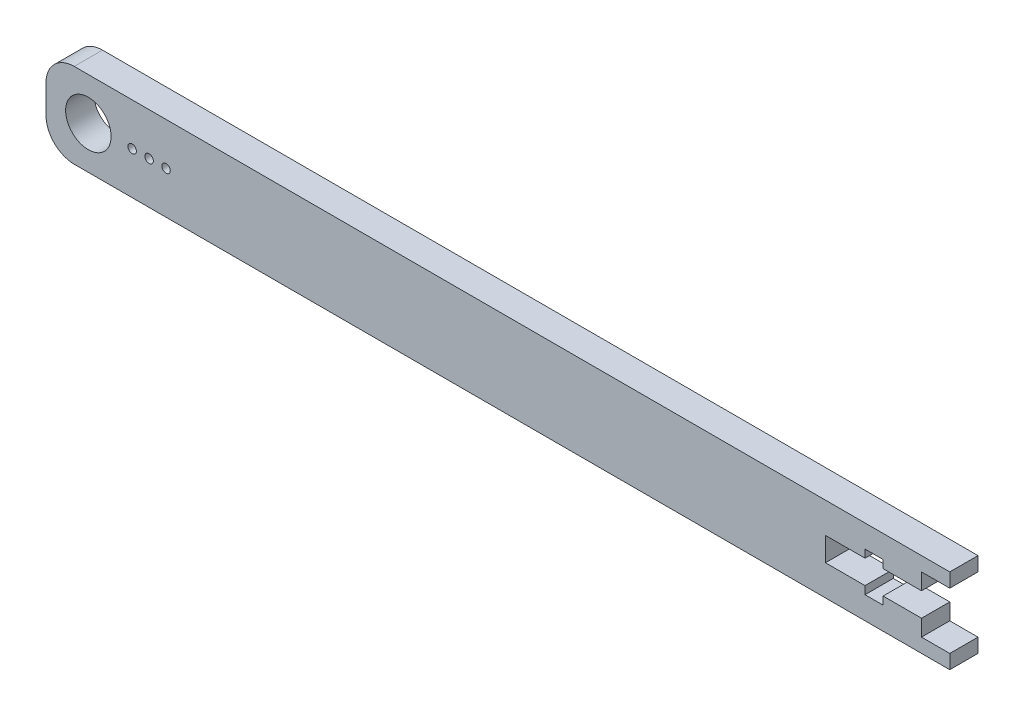
ISO-10303-21;
HEADER;
FILE_DESCRIPTION(('STEP AP214'),'2;1');
FILE_NAME('part.step','',(''),(''),'','','');
FILE_SCHEMA(('AUTOMOTIVE_DESIGN { 1 0 10303 214 1 1 1 1 }'));
ENDSEC;
DATA;
#1=APPLICATION_CONTEXT('core data for automotive mechanical design processes');
#2=APPLICATION_PROTOCOL_DEFINITION('international standard','automotive_design',2000,#1);
#3=PRODUCT_CONTEXT('',#1,'mechanical');
#4=PRODUCT('Part','Part','',(#3));
#5=PRODUCT_RELATED_PRODUCT_CATEGORY('part','',(#4));
#6=PRODUCT_DEFINITION_FORMATION('','',#4);
#7=PRODUCT_DEFINITION_CONTEXT('part definition',#1,'design');
#8=PRODUCT_DEFINITION('design','',#6,#7);
#9=PRODUCT_DEFINITION_SHAPE('','',#8);
#10=(LENGTH_UNIT() NAMED_UNIT(*) SI_UNIT(.MILLI.,.METRE.));
#11=(NAMED_UNIT(*) PLANE_ANGLE_UNIT() SI_UNIT($,.RADIAN.));
#12=(NAMED_UNIT(*) SI_UNIT($,.STERADIAN.) SOLID_ANGLE_UNIT());
#13=UNCERTAINTY_MEASURE_WITH_UNIT(LENGTH_MEASURE(1.E-05),#10,'distance_accuracy_value','');
#14=(GEOMETRIC_REPRESENTATION_CONTEXT(3) GLOBAL_UNCERTAINTY_ASSIGNED_CONTEXT((#13)) GLOBAL_UNIT_ASSIGNED_CONTEXT((#10,
#11,#12)) REPRESENTATION_CONTEXT('',''));
#15=CARTESIAN_POINT('',(0.,0.,0.));
#16=DIRECTION('',(0.,0.,1.));
#17=DIRECTION('',(1.,0.,0.));
#18=AXIS2_PLACEMENT_3D('',#15,#16,#17);
#19=CARTESIAN_POINT('',(-65.,12.5,5.));
#20=DIRECTION('',(1.,0.,0.));
#21=DIRECTION('',(0.,0.,-1.));
#22=AXIS2_PLACEMENT_3D('',#19,#20,#21);
#23=PLANE('',#22);
#24=DIRECTION('',(0.,0.,1.));
#25=VECTOR('',#24,1.);
#26=CARTESIAN_POINT('',(-65.,9.6,5.));
#27=LINE('',#26,#25);
#28=CARTESIAN_POINT('',(-65.,9.6,0.));
#29=VERTEX_POINT('',#28);
#30=CARTESIAN_POINT('',(-65.,9.6,5.));
#31=VERTEX_POINT('',#30);
#32=EDGE_CURVE('E11',#29,#31,#27,.T.);
#33=ORIENTED_EDGE('',*,*,#32,.F.);
#34=DIRECTION('',(0.,-1.,0.));
#35=VECTOR('',#34,1.);
#36=CARTESIAN_POINT('',(-65.,12.5,0.));
#37=LINE('',#36,#35);
#38=CARTESIAN_POINT('',(-65.,12.5,0.));
#39=VERTEX_POINT('',#38);
#40=EDGE_CURVE('E250',#39,#29,#37,.T.);
#41=ORIENTED_EDGE('',*,*,#40,.F.);
#42=DIRECTION('',(0.,0.,-1.));
#43=VECTOR('',#42,1.);
#44=CARTESIAN_POINT('',(-65.,12.5,5.));
#45=LINE('',#44,#43);
#46=CARTESIAN_POINT('',(-65.,12.5,5.));
#47=VERTEX_POINT('',#46);
#48=EDGE_CURVE('E266',#47,#39,#45,.T.);
#49=ORIENTED_EDGE('',*,*,#48,.F.);
#50=DIRECTION('',(0.,-1.,0.));
#51=VECTOR('',#50,1.);
#52=CARTESIAN_POINT('',(-65.,12.5,5.));
#53=LINE('',#52,#51);
#54=EDGE_CURVE('E394',#47,#31,#53,.T.);
#55=ORIENTED_EDGE('',*,*,#54,.T.);
#56=EDGE_LOOP('',(#33,#41,#49,#55));
#57=FACE_BOUND('',#56,.T.);
#58=ADVANCED_FACE('F33',(#57),#23,.T.);
#59=CARTESIAN_POINT('',(-215.,5.,5.));
#60=DIRECTION('',(0.,0.,1.));
#61=DIRECTION('',(1.,0.,0.));
#62=AXIS2_PLACEMENT_3D('',#59,#60,#61);
#63=PLANE('',#62);
#64=DIRECTION('',(0.,-1.,0.));
#65=VECTOR('',#64,1.);
#66=CARTESIAN_POINT('',(-60.,5.,5.));
#67=LINE('',#66,#65);
#68=CARTESIAN_POINT('',(-60.,15.,5.));
#69=VERTEX_POINT('',#68);
#70=CARTESIAN_POINT('',(-60.,12.5,5.));
#71=VERTEX_POINT('',#70);
#72=EDGE_CURVE('E56',#69,#71,#67,.T.);
#73=ORIENTED_EDGE('',*,*,#72,.F.);
#74=DIRECTION('',(-1.,0.,0.));
#75=VECTOR('',#74,1.);
#76=CARTESIAN_POINT('',(-215.,15.,5.));
#77=LINE('',#76,#75);
#78=CARTESIAN_POINT('',(-215.,15.,5.));
#79=VERTEX_POINT('',#78);
#80=EDGE_CURVE('E278',#69,#79,#77,.T.);
#81=ORIENTED_EDGE('',*,*,#80,.T.);
#82=CARTESIAN_POINT('',(-215.,10.,5.));
#83=DIRECTION('',(0.,0.,1.));
#84=DIRECTION('',(1.,0.,0.));
#85=AXIS2_PLACEMENT_3D('',#82,#83,#84);
#86=CIRCLE('',#85,5.);
#87=CARTESIAN_POINT('',(-220.,9.99999999999996,5.));
#88=VERTEX_POINT('',#87);
#89=EDGE_CURVE('E280',#79,#88,#86,.T.);
#90=ORIENTED_EDGE('',*,*,#89,.T.);
#91=DIRECTION('',(0.,-1.,0.));
#92=VECTOR('',#91,1.);
#93=CARTESIAN_POINT('',(-220.,9.99999999999996,5.));
#94=LINE('',#93,#92);
#95=CARTESIAN_POINT('',(-220.,5.00000000000004,5.));
#96=VERTEX_POINT('',#95);
#97=EDGE_CURVE('E226',#88,#96,#94,.T.);
#98=ORIENTED_EDGE('',*,*,#97,.T.);
#99=CARTESIAN_POINT('',(-215.,5.,5.));
#100=DIRECTION('',(0.,0.,1.));
#101=DIRECTION('',(1.,0.,0.));
#102=AXIS2_PLACEMENT_3D('',#99,#100,#101);
#103=CIRCLE('',#102,5.);
#104=CARTESIAN_POINT('',(-215.,0.,5.));
#105=VERTEX_POINT('',#104);
#106=EDGE_CURVE('E221',#96,#105,#103,.T.);
#107=ORIENTED_EDGE('',*,*,#106,.T.);
#108=DIRECTION('',(1.,0.,0.));
#109=VECTOR('',#108,1.);
#110=CARTESIAN_POINT('',(-215.,0.,5.));
#111=LINE('',#110,#109);
#112=CARTESIAN_POINT('',(-60.,0.,5.));
#113=VERTEX_POINT('',#112);
#114=EDGE_CURVE('E276',#105,#113,#111,.T.);
#115=ORIENTED_EDGE('',*,*,#114,.T.);
#116=CARTESIAN_POINT('',(-60.,2.5,5.));
#117=VERTEX_POINT('',#116);
#118=EDGE_CURVE('E187',#117,#113,#67,.T.);
#119=ORIENTED_EDGE('',*,*,#118,.F.);
#120=DIRECTION('',(1.,0.,0.));
#121=VECTOR('',#120,1.);
#122=CARTESIAN_POINT('',(-65.,2.5,5.));
#123=LINE('',#122,#121);
#124=CARTESIAN_POINT('',(-65.,2.5,5.));
#125=VERTEX_POINT('',#124);
#126=EDGE_CURVE('E396',#125,#117,#123,.T.);
#127=ORIENTED_EDGE('',*,*,#126,.F.);
#128=CARTESIAN_POINT('',(-65.,5.4,5.));
#129=VERTEX_POINT('',#128);
#130=EDGE_CURVE('E265',#129,#125,#53,.T.);
#131=ORIENTED_EDGE('',*,*,#130,.F.);
#132=DIRECTION('',(1.,0.,0.));
#133=VECTOR('',#132,1.);
#134=CARTESIAN_POINT('',(-215.,5.4,5.));
#135=LINE('',#134,#133);
#136=CARTESIAN_POINT('',(-71.8,5.4,5.));
#137=VERTEX_POINT('',#136);
#138=EDGE_CURVE('E48',#137,#129,#135,.T.);
#139=ORIENTED_EDGE('',*,*,#138,.F.);
#140=DIRECTION('',(0.,1.,0.));
#141=VECTOR('',#140,1.);
#142=CARTESIAN_POINT('',(-71.8,5.,5.));
#143=LINE('',#142,#141);
#144=CARTESIAN_POINT('',(-71.8,4.,5.));
#145=VERTEX_POINT('',#144);
#146=EDGE_CURVE('E356',#145,#137,#143,.T.);
#147=ORIENTED_EDGE('',*,*,#146,.F.);
#148=DIRECTION('',(1.,0.,0.));
#149=VECTOR('',#148,1.);
#150=CARTESIAN_POINT('',(-215.,4.,5.));
#151=LINE('',#150,#149);
#152=CARTESIAN_POINT('',(-75.,4.,5.));
#153=VERTEX_POINT('',#152);
#154=EDGE_CURVE('E358',#153,#145,#151,.T.);
#155=ORIENTED_EDGE('',*,*,#154,.F.);
#156=DIRECTION('',(0.,-1.,0.));
#157=VECTOR('',#156,1.);
#158=CARTESIAN_POINT('',(-75.,5.,5.));
#159=LINE('',#158,#157);
#160=CARTESIAN_POINT('',(-75.,5.4,5.));
#161=VERTEX_POINT('',#160);
#162=EDGE_CURVE('E360',#161,#153,#159,.T.);
#163=ORIENTED_EDGE('',*,*,#162,.F.);
#164=DIRECTION('',(1.,0.,0.));
#165=VECTOR('',#164,1.);
#166=CARTESIAN_POINT('',(-215.,5.4,5.));
#167=LINE('',#166,#165);
#168=CARTESIAN_POINT('',(-82.,5.4,5.));
#169=VERTEX_POINT('',#168);
#170=EDGE_CURVE('E362',#169,#161,#167,.T.);
#171=ORIENTED_EDGE('',*,*,#170,.F.);
#172=DIRECTION('',(0.,-1.,0.));
#173=VECTOR('',#172,1.);
#174=CARTESIAN_POINT('',(-82.,5.,5.));
#175=LINE('',#174,#173);
#176=CARTESIAN_POINT('',(-82.,9.6,5.));
#177=VERTEX_POINT('',#176);
#178=EDGE_CURVE('E364',#177,#169,#175,.T.);
#179=ORIENTED_EDGE('',*,*,#178,.F.);
#180=DIRECTION('',(-1.,0.,0.));
#181=VECTOR('',#180,1.);
#182=CARTESIAN_POINT('',(-215.,9.6,5.));
#183=LINE('',#182,#181);
#184=CARTESIAN_POINT('',(-75.,9.6,5.));
#185=VERTEX_POINT('',#184);
#186=EDGE_CURVE('E366',#185,#177,#183,.T.);
#187=ORIENTED_EDGE('',*,*,#186,.F.);
#188=DIRECTION('',(0.,-1.,0.));
#189=VECTOR('',#188,1.);
#190=CARTESIAN_POINT('',(-75.,5.,5.));
#191=LINE('',#190,#189);
#192=CARTESIAN_POINT('',(-75.,11.,5.));
#193=VERTEX_POINT('',#192);
#194=EDGE_CURVE('E368',#193,#185,#191,.T.);
#195=ORIENTED_EDGE('',*,*,#194,.F.);
#196=DIRECTION('',(-1.,0.,0.));
#197=VECTOR('',#196,1.);
#198=CARTESIAN_POINT('',(-215.,11.0000000000001,5.));
#199=LINE('',#198,#197);
#200=CARTESIAN_POINT('',(-71.8,11.,5.));
#201=VERTEX_POINT('',#200);
#202=EDGE_CURVE('E370',#201,#193,#199,.T.);
#203=ORIENTED_EDGE('',*,*,#202,.F.);
#204=DIRECTION('',(0.,1.,0.));
#205=VECTOR('',#204,1.);
#206=CARTESIAN_POINT('',(-71.8,5.,5.));
#207=LINE('',#206,#205);
#208=CARTESIAN_POINT('',(-71.8,9.6,5.));
#209=VERTEX_POINT('',#208);
#210=EDGE_CURVE('E372',#209,#201,#207,.T.);
#211=ORIENTED_EDGE('',*,*,#210,.F.);
#212=DIRECTION('',(-1.,0.,0.));
#213=VECTOR('',#212,1.);
#214=CARTESIAN_POINT('',(-215.,9.60000000000004,5.));
#215=LINE('',#214,#213);
#216=EDGE_CURVE('E354',#31,#209,#215,.T.);
#217=ORIENTED_EDGE('',*,*,#216,.F.);
#218=ORIENTED_EDGE('',*,*,#54,.F.);
#219=DIRECTION('',(-1.,0.,0.));
#220=VECTOR('',#219,1.);
#221=CARTESIAN_POINT('',(-65.,12.5,5.));
#222=LINE('',#221,#220);
#223=EDGE_CURVE('E259',#71,#47,#222,.T.);
#224=ORIENTED_EDGE('',*,*,#223,.F.);
#225=EDGE_LOOP('',(#73,#81,#90,#98,#107,#115,#119,#127,#131,#139,#147,#155,#163,#171,#179,#187,
#195,#203,#211,#217,#218,#224));
#226=FACE_BOUND('',#225,.T.);
#227=CARTESIAN_POINT('',(-201.75,7.5,5.));
#228=DIRECTION('',(0.,0.,1.));
#229=DIRECTION('',(1.,0.,0.));
#230=AXIS2_PLACEMENT_3D('',#227,#228,#229);
#231=CIRCLE('',#230,0.750000000000012);
#232=CARTESIAN_POINT('',(-201.,7.5,5.));
#233=VERTEX_POINT('',#232);
#234=EDGE_CURVE('E381',#233,#233,#231,.T.);
#235=ORIENTED_EDGE('',*,*,#234,.F.);
#236=EDGE_LOOP('',(#235));
#237=FACE_BOUND('',#236,.T.);
#238=CARTESIAN_POINT('',(-212.5,7.5,5.));
#239=DIRECTION('',(0.,0.,1.));
#240=DIRECTION('',(1.,0.,0.));
#241=AXIS2_PLACEMENT_3D('',#238,#239,#240);
#242=CIRCLE('',#241,4.025);
#243=CARTESIAN_POINT('',(-208.475,7.5,5.));
#244=VERTEX_POINT('',#243);
#245=EDGE_CURVE('E251',#244,#244,#242,.T.);
#246=ORIENTED_EDGE('',*,*,#245,.F.);
#247=EDGE_LOOP('',(#246));
#248=FACE_BOUND('',#247,.T.);
#249=CARTESIAN_POINT('',(-204.75,7.5,5.));
#250=DIRECTION('',(0.,0.,1.));
#251=DIRECTION('',(1.,0.,0.));
#252=AXIS2_PLACEMENT_3D('',#249,#250,#251);
#253=CIRCLE('',#252,0.750000000000012);
#254=CARTESIAN_POINT('',(-204.,7.5,5.));
#255=VERTEX_POINT('',#254);
#256=EDGE_CURVE('E387',#255,#255,#253,.T.);
#257=ORIENTED_EDGE('',*,*,#256,.F.);
#258=EDGE_LOOP('',(#257));
#259=FACE_BOUND('',#258,.T.);
#260=CARTESIAN_POINT('',(-198.75,7.5,5.));
#261=DIRECTION('',(0.,0.,1.));
#262=DIRECTION('',(1.,0.,0.));
#263=AXIS2_PLACEMENT_3D('',#260,#261,#262);
#264=CIRCLE('',#263,0.750000000000012);
#265=CARTESIAN_POINT('',(-198.,7.5,5.));
#266=VERTEX_POINT('',#265);
#267=EDGE_CURVE('E375',#266,#266,#264,.T.);
#268=ORIENTED_EDGE('',*,*,#267,.F.);
#269=EDGE_LOOP('',(#268));
#270=FACE_BOUND('',#269,.T.);
#271=ADVANCED_FACE('F284',(#226,#237,#248,#259,#270),#63,.T.);
#272=CARTESIAN_POINT('',(-215.,5.,0.));
#273=DIRECTION('',(0.,0.,1.));
#274=DIRECTION('',(1.,0.,0.));
#275=AXIS2_PLACEMENT_3D('',#272,#273,#274);
#276=PLANE('',#275);
#277=DIRECTION('',(-1.,0.,0.));
#278=VECTOR('',#277,1.);
#279=CARTESIAN_POINT('',(-215.,15.,0.));
#280=LINE('',#279,#278);
#281=CARTESIAN_POINT('',(-60.,15.,0.));
#282=VERTEX_POINT('',#281);
#283=CARTESIAN_POINT('',(-215.,15.,0.));
#284=VERTEX_POINT('',#283);
#285=EDGE_CURVE('E209',#282,#284,#280,.T.);
#286=ORIENTED_EDGE('',*,*,#285,.F.);
#287=DIRECTION('',(0.,1.,0.));
#288=VECTOR('',#287,1.);
#289=CARTESIAN_POINT('',(-60.,15.,0.));
#290=LINE('',#289,#288);
#291=CARTESIAN_POINT('',(-60.,12.5,0.));
#292=VERTEX_POINT('',#291);
#293=EDGE_CURVE('E204',#292,#282,#290,.T.);
#294=ORIENTED_EDGE('',*,*,#293,.F.);
#295=DIRECTION('',(-1.,0.,0.));
#296=VECTOR('',#295,1.);
#297=CARTESIAN_POINT('',(-65.,12.5,0.));
#298=LINE('',#297,#296);
#299=EDGE_CURVE('E262',#292,#39,#298,.T.);
#300=ORIENTED_EDGE('',*,*,#299,.T.);
#301=ORIENTED_EDGE('',*,*,#40,.T.);
#302=DIRECTION('',(1.,0.,0.));
#303=VECTOR('',#302,1.);
#304=CARTESIAN_POINT('',(-65.,9.6,0.));
#305=LINE('',#304,#303);
#306=CARTESIAN_POINT('',(-71.8,9.6,0.));
#307=VERTEX_POINT('',#306);
#308=EDGE_CURVE('E331',#307,#29,#305,.T.);
#309=ORIENTED_EDGE('',*,*,#308,.F.);
#310=DIRECTION('',(0.,-1.,0.));
#311=VECTOR('',#310,1.);
#312=CARTESIAN_POINT('',(-71.8,9.6,0.));
#313=LINE('',#312,#311);
#314=CARTESIAN_POINT('',(-71.8,11.,0.));
#315=VERTEX_POINT('',#314);
#316=EDGE_CURVE('E328',#315,#307,#313,.T.);
#317=ORIENTED_EDGE('',*,*,#316,.F.);
#318=DIRECTION('',(1.,0.,0.));
#319=VECTOR('',#318,1.);
#320=CARTESIAN_POINT('',(-71.8,11.,0.));
#321=LINE('',#320,#319);
#322=CARTESIAN_POINT('',(-75.,11.,0.));
#323=VERTEX_POINT('',#322);
#324=EDGE_CURVE('E325',#323,#315,#321,.T.);
#325=ORIENTED_EDGE('',*,*,#324,.F.);
#326=DIRECTION('',(0.,1.,0.));
#327=VECTOR('',#326,1.);
#328=CARTESIAN_POINT('',(-75.,11.,0.));
#329=LINE('',#328,#327);
#330=CARTESIAN_POINT('',(-75.,9.6,0.));
#331=VERTEX_POINT('',#330);
#332=EDGE_CURVE('E322',#331,#323,#329,.T.);
#333=ORIENTED_EDGE('',*,*,#332,.F.);
#334=DIRECTION('',(1.,0.,0.));
#335=VECTOR('',#334,1.);
#336=CARTESIAN_POINT('',(-75.,9.6,0.));
#337=LINE('',#336,#335);
#338=CARTESIAN_POINT('',(-82.,9.6,0.));
#339=VERTEX_POINT('',#338);
#340=EDGE_CURVE('E319',#339,#331,#337,.T.);
#341=ORIENTED_EDGE('',*,*,#340,.F.);
#342=DIRECTION('',(0.,1.,0.));
#343=VECTOR('',#342,1.);
#344=CARTESIAN_POINT('',(-82.,9.6,0.));
#345=LINE('',#344,#343);
#346=CARTESIAN_POINT('',(-82.,5.4,0.));
#347=VERTEX_POINT('',#346);
#348=EDGE_CURVE('E316',#347,#339,#345,.T.);
#349=ORIENTED_EDGE('',*,*,#348,.F.);
#350=DIRECTION('',(-1.,0.,0.));
#351=VECTOR('',#350,1.);
#352=CARTESIAN_POINT('',(-82.,5.4,0.));
#353=LINE('',#352,#351);
#354=CARTESIAN_POINT('',(-75.,5.4,0.));
#355=VERTEX_POINT('',#354);
#356=EDGE_CURVE('E313',#355,#347,#353,.T.);
#357=ORIENTED_EDGE('',*,*,#356,.F.);
#358=DIRECTION('',(0.,1.,0.));
#359=VECTOR('',#358,1.);
#360=CARTESIAN_POINT('',(-75.,5.4,0.));
#361=LINE('',#360,#359);
#362=CARTESIAN_POINT('',(-75.,4.,0.));
#363=VERTEX_POINT('',#362);
#364=EDGE_CURVE('E310',#363,#355,#361,.T.);
#365=ORIENTED_EDGE('',*,*,#364,.F.);
#366=DIRECTION('',(-1.,0.,0.));
#367=VECTOR('',#366,1.);
#368=CARTESIAN_POINT('',(-75.,4.,0.));
#369=LINE('',#368,#367);
#370=CARTESIAN_POINT('',(-71.8,4.,0.));
#371=VERTEX_POINT('',#370);
#372=EDGE_CURVE('E307',#371,#363,#369,.T.);
#373=ORIENTED_EDGE('',*,*,#372,.F.);
#374=DIRECTION('',(0.,-1.,0.));
#375=VECTOR('',#374,1.);
#376=CARTESIAN_POINT('',(-71.8,4.,0.));
#377=LINE('',#376,#375);
#378=CARTESIAN_POINT('',(-71.8,5.4,0.));
#379=VERTEX_POINT('',#378);
#380=EDGE_CURVE('E245',#379,#371,#377,.T.);
#381=ORIENTED_EDGE('',*,*,#380,.F.);
#382=DIRECTION('',(-1.,0.,0.));
#383=VECTOR('',#382,1.);
#384=CARTESIAN_POINT('',(-71.8,5.4,0.));
#385=LINE('',#384,#383);
#386=CARTESIAN_POINT('',(-65.,5.4,0.));
#387=VERTEX_POINT('',#386);
#388=EDGE_CURVE('E237',#387,#379,#385,.T.);
#389=ORIENTED_EDGE('',*,*,#388,.F.);
#390=CARTESIAN_POINT('',(-65.,2.5,0.));
#391=VERTEX_POINT('',#390);
#392=EDGE_CURVE('E242',#387,#391,#37,.T.);
#393=ORIENTED_EDGE('',*,*,#392,.T.);
#394=DIRECTION('',(1.,0.,0.));
#395=VECTOR('',#394,1.);
#396=CARTESIAN_POINT('',(-65.,2.5,0.));
#397=LINE('',#396,#395);
#398=CARTESIAN_POINT('',(-60.,2.5,0.));
#399=VERTEX_POINT('',#398);
#400=EDGE_CURVE('E203',#391,#399,#397,.T.);
#401=ORIENTED_EDGE('',*,*,#400,.T.);
#402=CARTESIAN_POINT('',(-60.,0.,0.));
#403=VERTEX_POINT('',#402);
#404=EDGE_CURVE('E184',#403,#399,#290,.T.);
#405=ORIENTED_EDGE('',*,*,#404,.F.);
#406=DIRECTION('',(1.,0.,0.));
#407=VECTOR('',#406,1.);
#408=CARTESIAN_POINT('',(-215.,0.,0.));
#409=LINE('',#408,#407);
#410=CARTESIAN_POINT('',(-215.,0.,0.));
#411=VERTEX_POINT('',#410);
#412=EDGE_CURVE('E200',#411,#403,#409,.T.);
#413=ORIENTED_EDGE('',*,*,#412,.F.);
#414=CARTESIAN_POINT('',(-215.,5.,0.));
#415=DIRECTION('',(0.,0.,1.));
#416=DIRECTION('',(1.,0.,0.));
#417=AXIS2_PLACEMENT_3D('',#414,#415,#416);
#418=CIRCLE('',#417,5.);
#419=CARTESIAN_POINT('',(-220.,5.00000000000004,0.));
#420=VERTEX_POINT('',#419);
#421=EDGE_CURVE('E210',#420,#411,#418,.T.);
#422=ORIENTED_EDGE('',*,*,#421,.F.);
#423=DIRECTION('',(0.,-1.,0.));
#424=VECTOR('',#423,1.);
#425=CARTESIAN_POINT('',(-220.,9.99999999999996,0.));
#426=LINE('',#425,#424);
#427=CARTESIAN_POINT('',(-220.,9.99999999999996,0.));
#428=VERTEX_POINT('',#427);
#429=EDGE_CURVE('E219',#428,#420,#426,.T.);
#430=ORIENTED_EDGE('',*,*,#429,.F.);
#431=CARTESIAN_POINT('',(-215.,10.,0.));
#432=DIRECTION('',(0.,0.,1.));
#433=DIRECTION('',(1.,0.,0.));
#434=AXIS2_PLACEMENT_3D('',#431,#432,#433);
#435=CIRCLE('',#434,5.);
#436=EDGE_CURVE('E212',#284,#428,#435,.T.);
#437=ORIENTED_EDGE('',*,*,#436,.F.);
#438=EDGE_LOOP('',(#286,#294,#300,#301,#309,#317,#325,#333,#341,#349,#357,#365,#373,#381,#389,
#393,#401,#405,#413,#422,#430,#437));
#439=FACE_BOUND('',#438,.T.);
#440=CARTESIAN_POINT('',(-212.5,7.5,0.));
#441=DIRECTION('',(0.,0.,1.));
#442=DIRECTION('',(1.,0.,0.));
#443=AXIS2_PLACEMENT_3D('',#440,#441,#442);
#444=CIRCLE('',#443,4.025);
#445=CARTESIAN_POINT('',(-208.475,7.5,0.));
#446=VERTEX_POINT('',#445);
#447=EDGE_CURVE('E255',#446,#446,#444,.T.);
#448=ORIENTED_EDGE('',*,*,#447,.T.);
#449=EDGE_LOOP('',(#448));
#450=FACE_BOUND('',#449,.T.);
#451=CARTESIAN_POINT('',(-204.75,7.5,0.));
#452=DIRECTION('',(0.,0.,1.));
#453=DIRECTION('',(1.,0.,0.));
#454=AXIS2_PLACEMENT_3D('',#451,#452,#453);
#455=CIRCLE('',#454,0.750000000000012);
#456=CARTESIAN_POINT('',(-204.,7.5,0.));
#457=VERTEX_POINT('',#456);
#458=EDGE_CURVE('E384',#457,#457,#455,.T.);
#459=ORIENTED_EDGE('',*,*,#458,.T.);
#460=EDGE_LOOP('',(#459));
#461=FACE_BOUND('',#460,.T.);
#462=CARTESIAN_POINT('',(-201.75,7.5,0.));
#463=DIRECTION('',(0.,0.,1.));
#464=DIRECTION('',(1.,0.,0.));
#465=AXIS2_PLACEMENT_3D('',#462,#463,#464);
#466=CIRCLE('',#465,0.750000000000012);
#467=CARTESIAN_POINT('',(-201.,7.5,0.));
#468=VERTEX_POINT('',#467);
#469=EDGE_CURVE('E378',#468,#468,#466,.T.);
#470=ORIENTED_EDGE('',*,*,#469,.T.);
#471=EDGE_LOOP('',(#470));
#472=FACE_BOUND('',#471,.T.);
#473=CARTESIAN_POINT('',(-198.75,7.5,0.));
#474=DIRECTION('',(0.,0.,1.));
#475=DIRECTION('',(1.,0.,0.));
#476=AXIS2_PLACEMENT_3D('',#473,#474,#475);
#477=CIRCLE('',#476,0.750000000000012);
#478=CARTESIAN_POINT('',(-198.,7.5,0.));
#479=VERTEX_POINT('',#478);
#480=EDGE_CURVE('E374',#479,#479,#477,.T.);
#481=ORIENTED_EDGE('',*,*,#480,.T.);
#482=EDGE_LOOP('',(#481));
#483=FACE_BOUND('',#482,.T.);
#484=ADVANCED_FACE('F197',(#439,#450,#461,#472,#483),#276,.F.);
#485=CARTESIAN_POINT('',(-215.,5.,5.));
#486=DIRECTION('',(0.,0.,-1.));
#487=DIRECTION('',(-1.,0.,0.));
#488=AXIS2_PLACEMENT_3D('',#485,#486,#487);
#489=CYLINDRICAL_SURFACE('',#488,5.);
#490=ORIENTED_EDGE('',*,*,#421,.T.);
#491=DIRECTION('',(0.,0.,-1.));
#492=VECTOR('',#491,1.);
#493=CARTESIAN_POINT('',(-215.,0.,5.));
#494=LINE('',#493,#492);
#495=EDGE_CURVE('E191',#105,#411,#494,.T.);
#496=ORIENTED_EDGE('',*,*,#495,.F.);
#497=ORIENTED_EDGE('',*,*,#106,.F.);
#498=DIRECTION('',(0.,0.,-1.));
#499=VECTOR('',#498,1.);
#500=CARTESIAN_POINT('',(-220.,5.00000000000004,5.));
#501=LINE('',#500,#499);
#502=EDGE_CURVE('E222',#96,#420,#501,.T.);
#503=ORIENTED_EDGE('',*,*,#502,.T.);
#504=EDGE_LOOP('',(#490,#496,#497,#503));
#505=FACE_BOUND('',#504,.T.);
#506=ADVANCED_FACE('F35',(#505),#489,.T.);
#507=CARTESIAN_POINT('',(-215.,0.,5.));
#508=DIRECTION('',(0.,1.,0.));
#509=DIRECTION('',(-1.,0.,0.));
#510=AXIS2_PLACEMENT_3D('',#507,#508,#509);
#511=PLANE('',#510);
#512=ORIENTED_EDGE('',*,*,#412,.T.);
#513=DIRECTION('',(0.,0.,-1.));
#514=VECTOR('',#513,1.);
#515=CARTESIAN_POINT('',(-60.,0.,5.));
#516=LINE('',#515,#514);
#517=EDGE_CURVE('E181',#113,#403,#516,.T.);
#518=ORIENTED_EDGE('',*,*,#517,.F.);
#519=ORIENTED_EDGE('',*,*,#114,.F.);
#520=ORIENTED_EDGE('',*,*,#495,.T.);
#521=EDGE_LOOP('',(#512,#518,#519,#520));
#522=FACE_BOUND('',#521,.T.);
#523=ADVANCED_FACE('F206',(#522),#511,.F.);
#524=CARTESIAN_POINT('',(-215.,15.,5.));
#525=DIRECTION('',(0.,-1.,0.));
#526=DIRECTION('',(1.,0.,0.));
#527=AXIS2_PLACEMENT_3D('',#524,#525,#526);
#528=PLANE('',#527);
#529=ORIENTED_EDGE('',*,*,#285,.T.);
#530=DIRECTION('',(0.,0.,-1.));
#531=VECTOR('',#530,1.);
#532=CARTESIAN_POINT('',(-215.,15.,5.));
#533=LINE('',#532,#531);
#534=EDGE_CURVE('E229',#79,#284,#533,.T.);
#535=ORIENTED_EDGE('',*,*,#534,.F.);
#536=ORIENTED_EDGE('',*,*,#80,.F.);
#537=DIRECTION('',(0.,0.,-1.));
#538=VECTOR('',#537,1.);
#539=CARTESIAN_POINT('',(-60.,15.,5.));
#540=LINE('',#539,#538);
#541=EDGE_CURVE('E192',#69,#282,#540,.T.);
#542=ORIENTED_EDGE('',*,*,#541,.T.);
#543=EDGE_LOOP('',(#529,#535,#536,#542));
#544=FACE_BOUND('',#543,.T.);
#545=ADVANCED_FACE('F300',(#544),#528,.F.);
#546=CARTESIAN_POINT('',(-215.,10.,5.));
#547=DIRECTION('',(0.,0.,-1.));
#548=DIRECTION('',(-1.,0.,0.));
#549=AXIS2_PLACEMENT_3D('',#546,#547,#548);
#550=CYLINDRICAL_SURFACE('',#549,5.);
#551=ORIENTED_EDGE('',*,*,#436,.T.);
#552=DIRECTION('',(0.,0.,-1.));
#553=VECTOR('',#552,1.);
#554=CARTESIAN_POINT('',(-220.,9.99999999999996,5.));
#555=LINE('',#554,#553);
#556=EDGE_CURVE('E225',#88,#428,#555,.T.);
#557=ORIENTED_EDGE('',*,*,#556,.F.);
#558=ORIENTED_EDGE('',*,*,#89,.F.);
#559=ORIENTED_EDGE('',*,*,#534,.T.);
#560=EDGE_LOOP('',(#551,#557,#558,#559));
#561=FACE_BOUND('',#560,.T.);
#562=ADVANCED_FACE('F296',(#561),#550,.T.);
#563=CARTESIAN_POINT('',(-220.,9.99999999999996,5.));
#564=DIRECTION('',(1.,0.,0.));
#565=DIRECTION('',(0.,0.,-1.));
#566=AXIS2_PLACEMENT_3D('',#563,#564,#565);
#567=PLANE('',#566);
#568=ORIENTED_EDGE('',*,*,#429,.T.);
#569=ORIENTED_EDGE('',*,*,#502,.F.);
#570=ORIENTED_EDGE('',*,*,#97,.F.);
#571=ORIENTED_EDGE('',*,*,#556,.T.);
#572=EDGE_LOOP('',(#568,#569,#570,#571));
#573=FACE_BOUND('',#572,.T.);
#574=ADVANCED_FACE('F290',(#573),#567,.F.);
#575=DIRECTION('',(0.,0.,-1.));
#576=VECTOR('',#575,1.);
#577=CARTESIAN_POINT('',(-65.,5.4,5.));
#578=LINE('',#577,#576);
#579=EDGE_CURVE('E41',#129,#387,#578,.T.);
#580=ORIENTED_EDGE('',*,*,#579,.F.);
#581=ORIENTED_EDGE('',*,*,#130,.T.);
#582=DIRECTION('',(0.,0.,-1.));
#583=VECTOR('',#582,1.);
#584=CARTESIAN_POINT('',(-65.,2.5,5.));
#585=LINE('',#584,#583);
#586=EDGE_CURVE('E214',#125,#391,#585,.T.);
#587=ORIENTED_EDGE('',*,*,#586,.T.);
#588=ORIENTED_EDGE('',*,*,#392,.F.);
#589=EDGE_LOOP('',(#580,#581,#587,#588));
#590=FACE_BOUND('',#589,.T.);
#591=ADVANCED_FACE('F248',(#590),#23,.T.);
#592=CARTESIAN_POINT('',(-65.,2.5,5.));
#593=DIRECTION('',(0.,1.,0.));
#594=DIRECTION('',(0.,0.,1.));
#595=AXIS2_PLACEMENT_3D('',#592,#593,#594);
#596=PLANE('',#595);
#597=ORIENTED_EDGE('',*,*,#400,.F.);
#598=ORIENTED_EDGE('',*,*,#586,.F.);
#599=ORIENTED_EDGE('',*,*,#126,.T.);
#600=DIRECTION('',(0.,0.,-1.));
#601=VECTOR('',#600,1.);
#602=CARTESIAN_POINT('',(-60.,2.5,5.));
#603=LINE('',#602,#601);
#604=EDGE_CURVE('E271',#117,#399,#603,.T.);
#605=ORIENTED_EDGE('',*,*,#604,.T.);
#606=EDGE_LOOP('',(#597,#598,#599,#605));
#607=FACE_BOUND('',#606,.T.);
#608=ADVANCED_FACE('F453',(#607),#596,.T.);
#609=CARTESIAN_POINT('',(-65.,12.5,5.));
#610=DIRECTION('',(0.,-1.,0.));
#611=DIRECTION('',(0.,0.,-1.));
#612=AXIS2_PLACEMENT_3D('',#609,#610,#611);
#613=PLANE('',#612);
#614=ORIENTED_EDGE('',*,*,#299,.F.);
#615=DIRECTION('',(0.,0.,-1.));
#616=VECTOR('',#615,1.);
#617=CARTESIAN_POINT('',(-60.,12.5,5.));
#618=LINE('',#617,#616);
#619=EDGE_CURVE('E269',#71,#292,#618,.T.);
#620=ORIENTED_EDGE('',*,*,#619,.F.);
#621=ORIENTED_EDGE('',*,*,#223,.T.);
#622=ORIENTED_EDGE('',*,*,#48,.T.);
#623=EDGE_LOOP('',(#614,#620,#621,#622));
#624=FACE_BOUND('',#623,.T.);
#625=ADVANCED_FACE('F403',(#624),#613,.T.);
#626=CARTESIAN_POINT('',(-212.5,7.5,5.));
#627=DIRECTION('',(0.,0.,-1.));
#628=DIRECTION('',(-1.,0.,0.));
#629=AXIS2_PLACEMENT_3D('',#626,#627,#628);
#630=CYLINDRICAL_SURFACE('',#629,4.025);
#631=ORIENTED_EDGE('',*,*,#245,.T.);
#632=EDGE_LOOP('',(#631));
#633=FACE_BOUND('',#632,.T.);
#634=ORIENTED_EDGE('',*,*,#447,.F.);
#635=EDGE_LOOP('',(#634));
#636=FACE_BOUND('',#635,.T.);
#637=ADVANCED_FACE('F460',(#633,#636),#630,.F.);
#638=CARTESIAN_POINT('',(-204.75,7.5,5.));
#639=DIRECTION('',(0.,0.,-1.));
#640=DIRECTION('',(-1.,0.,0.));
#641=AXIS2_PLACEMENT_3D('',#638,#639,#640);
#642=CYLINDRICAL_SURFACE('',#641,0.750000000000012);
#643=ORIENTED_EDGE('',*,*,#256,.T.);
#644=EDGE_LOOP('',(#643));
#645=FACE_BOUND('',#644,.T.);
#646=ORIENTED_EDGE('',*,*,#458,.F.);
#647=EDGE_LOOP('',(#646));
#648=FACE_BOUND('',#647,.T.);
#649=ADVANCED_FACE('F613',(#645,#648),#642,.F.);
#650=CARTESIAN_POINT('',(-201.75,7.5,5.));
#651=DIRECTION('',(0.,0.,-1.));
#652=DIRECTION('',(-1.,0.,0.));
#653=AXIS2_PLACEMENT_3D('',#650,#651,#652);
#654=CYLINDRICAL_SURFACE('',#653,0.750000000000012);
#655=ORIENTED_EDGE('',*,*,#234,.T.);
#656=EDGE_LOOP('',(#655));
#657=FACE_BOUND('',#656,.T.);
#658=ORIENTED_EDGE('',*,*,#469,.F.);
#659=EDGE_LOOP('',(#658));
#660=FACE_BOUND('',#659,.T.);
#661=ADVANCED_FACE('F603',(#657,#660),#654,.F.);
#662=CARTESIAN_POINT('',(-198.75,7.5,5.));
#663=DIRECTION('',(0.,0.,-1.));
#664=DIRECTION('',(-1.,0.,0.));
#665=AXIS2_PLACEMENT_3D('',#662,#663,#664);
#666=CYLINDRICAL_SURFACE('',#665,0.750000000000012);
#667=ORIENTED_EDGE('',*,*,#267,.T.);
#668=EDGE_LOOP('',(#667));
#669=FACE_BOUND('',#668,.T.);
#670=ORIENTED_EDGE('',*,*,#480,.F.);
#671=EDGE_LOOP('',(#670));
#672=FACE_BOUND('',#671,.T.);
#673=ADVANCED_FACE('F582',(#669,#672),#666,.F.);
#674=CARTESIAN_POINT('',(-65.,9.6,10.));
#675=DIRECTION('',(0.,1.,0.));
#676=DIRECTION('',(-1.,0.,0.));
#677=AXIS2_PLACEMENT_3D('',#674,#675,#676);
#678=PLANE('',#677);
#679=ORIENTED_EDGE('',*,*,#216,.T.);
#680=DIRECTION('',(0.,0.,-1.));
#681=VECTOR('',#680,1.);
#682=CARTESIAN_POINT('',(-71.8,9.6,10.));
#683=LINE('',#682,#681);
#684=EDGE_CURVE('E334',#209,#307,#683,.T.);
#685=ORIENTED_EDGE('',*,*,#684,.T.);
#686=ORIENTED_EDGE('',*,*,#308,.T.);
#687=ORIENTED_EDGE('',*,*,#32,.T.);
#688=EDGE_LOOP('',(#679,#685,#686,#687));
#689=FACE_BOUND('',#688,.T.);
#690=ADVANCED_FACE('F411',(#689),#678,.F.);
#691=CARTESIAN_POINT('',(-71.8,9.6,10.));
#692=DIRECTION('',(1.,0.,0.));
#693=DIRECTION('',(0.,0.,-1.));
#694=AXIS2_PLACEMENT_3D('',#691,#692,#693);
#695=PLANE('',#694);
#696=ORIENTED_EDGE('',*,*,#210,.T.);
#697=DIRECTION('',(0.,0.,-1.));
#698=VECTOR('',#697,1.);
#699=CARTESIAN_POINT('',(-71.8,11.,10.));
#700=LINE('',#699,#698);
#701=EDGE_CURVE('E336',#201,#315,#700,.T.);
#702=ORIENTED_EDGE('',*,*,#701,.T.);
#703=ORIENTED_EDGE('',*,*,#316,.T.);
#704=ORIENTED_EDGE('',*,*,#684,.F.);
#705=EDGE_LOOP('',(#696,#702,#703,#704));
#706=FACE_BOUND('',#705,.T.);
#707=ADVANCED_FACE('F413',(#706),#695,.F.);
#708=CARTESIAN_POINT('',(-71.8,11.,10.));
#709=DIRECTION('',(0.,1.,0.));
#710=DIRECTION('',(-1.,0.,0.));
#711=AXIS2_PLACEMENT_3D('',#708,#709,#710);
#712=PLANE('',#711);
#713=ORIENTED_EDGE('',*,*,#202,.T.);
#714=DIRECTION('',(0.,0.,-1.));
#715=VECTOR('',#714,1.);
#716=CARTESIAN_POINT('',(-75.,11.,10.));
#717=LINE('',#716,#715);
#718=EDGE_CURVE('E338',#193,#323,#717,.T.);
#719=ORIENTED_EDGE('',*,*,#718,.T.);
#720=ORIENTED_EDGE('',*,*,#324,.T.);
#721=ORIENTED_EDGE('',*,*,#701,.F.);
#722=EDGE_LOOP('',(#713,#719,#720,#721));
#723=FACE_BOUND('',#722,.T.);
#724=ADVANCED_FACE('F421',(#723),#712,.F.);
#725=CARTESIAN_POINT('',(-75.,11.,10.));
#726=DIRECTION('',(-1.,0.,0.));
#727=DIRECTION('',(0.,0.,1.));
#728=AXIS2_PLACEMENT_3D('',#725,#726,#727);
#729=PLANE('',#728);
#730=ORIENTED_EDGE('',*,*,#194,.T.);
#731=DIRECTION('',(0.,0.,-1.));
#732=VECTOR('',#731,1.);
#733=CARTESIAN_POINT('',(-75.,9.6,10.));
#734=LINE('',#733,#732);
#735=EDGE_CURVE('E340',#185,#331,#734,.T.);
#736=ORIENTED_EDGE('',*,*,#735,.T.);
#737=ORIENTED_EDGE('',*,*,#332,.T.);
#738=ORIENTED_EDGE('',*,*,#718,.F.);
#739=EDGE_LOOP('',(#730,#736,#737,#738));
#740=FACE_BOUND('',#739,.T.);
#741=ADVANCED_FACE('F425',(#740),#729,.F.);
#742=CARTESIAN_POINT('',(-75.,9.6,10.));
#743=DIRECTION('',(0.,1.,0.));
#744=DIRECTION('',(0.,0.,1.));
#745=AXIS2_PLACEMENT_3D('',#742,#743,#744);
#746=PLANE('',#745);
#747=ORIENTED_EDGE('',*,*,#186,.T.);
#748=DIRECTION('',(0.,0.,-1.));
#749=VECTOR('',#748,1.);
#750=CARTESIAN_POINT('',(-82.,9.6,10.));
#751=LINE('',#750,#749);
#752=EDGE_CURVE('E342',#177,#339,#751,.T.);
#753=ORIENTED_EDGE('',*,*,#752,.T.);
#754=ORIENTED_EDGE('',*,*,#340,.T.);
#755=ORIENTED_EDGE('',*,*,#735,.F.);
#756=EDGE_LOOP('',(#747,#753,#754,#755));
#757=FACE_BOUND('',#756,.T.);
#758=ADVANCED_FACE('F429',(#757),#746,.F.);
#759=CARTESIAN_POINT('',(-82.,9.6,10.));
#760=DIRECTION('',(-1.,0.,0.));
#761=DIRECTION('',(0.,0.,1.));
#762=AXIS2_PLACEMENT_3D('',#759,#760,#761);
#763=PLANE('',#762);
#764=ORIENTED_EDGE('',*,*,#178,.T.);
#765=DIRECTION('',(0.,0.,-1.));
#766=VECTOR('',#765,1.);
#767=CARTESIAN_POINT('',(-82.,5.4,10.));
#768=LINE('',#767,#766);
#769=EDGE_CURVE('E344',#169,#347,#768,.T.);
#770=ORIENTED_EDGE('',*,*,#769,.T.);
#771=ORIENTED_EDGE('',*,*,#348,.T.);
#772=ORIENTED_EDGE('',*,*,#752,.F.);
#773=EDGE_LOOP('',(#764,#770,#771,#772));
#774=FACE_BOUND('',#773,.T.);
#775=ADVANCED_FACE('F435',(#774),#763,.F.);
#776=CARTESIAN_POINT('',(-82.,5.4,10.));
#777=DIRECTION('',(0.,-1.,0.));
#778=DIRECTION('',(0.,0.,-1.));
#779=AXIS2_PLACEMENT_3D('',#776,#777,#778);
#780=PLANE('',#779);
#781=ORIENTED_EDGE('',*,*,#170,.T.);
#782=DIRECTION('',(0.,0.,-1.));
#783=VECTOR('',#782,1.);
#784=CARTESIAN_POINT('',(-75.,5.4,10.));
#785=LINE('',#784,#783);
#786=EDGE_CURVE('E346',#161,#355,#785,.T.);
#787=ORIENTED_EDGE('',*,*,#786,.T.);
#788=ORIENTED_EDGE('',*,*,#356,.T.);
#789=ORIENTED_EDGE('',*,*,#769,.F.);
#790=EDGE_LOOP('',(#781,#787,#788,#789));
#791=FACE_BOUND('',#790,.T.);
#792=ADVANCED_FACE('F440',(#791),#780,.F.);
#793=CARTESIAN_POINT('',(-75.,5.4,10.));
#794=DIRECTION('',(-1.,0.,0.));
#795=DIRECTION('',(0.,0.,1.));
#796=AXIS2_PLACEMENT_3D('',#793,#794,#795);
#797=PLANE('',#796);
#798=ORIENTED_EDGE('',*,*,#162,.T.);
#799=DIRECTION('',(0.,0.,-1.));
#800=VECTOR('',#799,1.);
#801=CARTESIAN_POINT('',(-75.,4.,10.));
#802=LINE('',#801,#800);
#803=EDGE_CURVE('E348',#153,#363,#802,.T.);
#804=ORIENTED_EDGE('',*,*,#803,.T.);
#805=ORIENTED_EDGE('',*,*,#364,.T.);
#806=ORIENTED_EDGE('',*,*,#786,.F.);
#807=EDGE_LOOP('',(#798,#804,#805,#806));
#808=FACE_BOUND('',#807,.T.);
#809=ADVANCED_FACE('F444',(#808),#797,.F.);
#810=CARTESIAN_POINT('',(-75.,4.,10.));
#811=DIRECTION('',(0.,-1.,0.));
#812=DIRECTION('',(0.,0.,-1.));
#813=AXIS2_PLACEMENT_3D('',#810,#811,#812);
#814=PLANE('',#813);
#815=ORIENTED_EDGE('',*,*,#154,.T.);
#816=DIRECTION('',(0.,0.,-1.));
#817=VECTOR('',#816,1.);
#818=CARTESIAN_POINT('',(-71.8,4.,10.));
#819=LINE('',#818,#817);
#820=EDGE_CURVE('E350',#145,#371,#819,.T.);
#821=ORIENTED_EDGE('',*,*,#820,.T.);
#822=ORIENTED_EDGE('',*,*,#372,.T.);
#823=ORIENTED_EDGE('',*,*,#803,.F.);
#824=EDGE_LOOP('',(#815,#821,#822,#823));
#825=FACE_BOUND('',#824,.T.);
#826=ADVANCED_FACE('F447',(#825),#814,.F.);
#827=CARTESIAN_POINT('',(-71.8,4.,10.));
#828=DIRECTION('',(1.,0.,0.));
#829=DIRECTION('',(0.,0.,-1.));
#830=AXIS2_PLACEMENT_3D('',#827,#828,#829);
#831=PLANE('',#830);
#832=ORIENTED_EDGE('',*,*,#146,.T.);
#833=DIRECTION('',(0.,0.,-1.));
#834=VECTOR('',#833,1.);
#835=CARTESIAN_POINT('',(-71.8,5.4,10.));
#836=LINE('',#835,#834);
#837=EDGE_CURVE('E333',#137,#379,#836,.T.);
#838=ORIENTED_EDGE('',*,*,#837,.T.);
#839=ORIENTED_EDGE('',*,*,#380,.T.);
#840=ORIENTED_EDGE('',*,*,#820,.F.);
#841=EDGE_LOOP('',(#832,#838,#839,#840));
#842=FACE_BOUND('',#841,.T.);
#843=ADVANCED_FACE('F452',(#842),#831,.F.);
#844=CARTESIAN_POINT('',(-71.8,5.4,10.));
#845=DIRECTION('',(0.,-1.,0.));
#846=DIRECTION('',(0.,0.,-1.));
#847=AXIS2_PLACEMENT_3D('',#844,#845,#846);
#848=PLANE('',#847);
#849=ORIENTED_EDGE('',*,*,#138,.T.);
#850=ORIENTED_EDGE('',*,*,#579,.T.);
#851=ORIENTED_EDGE('',*,*,#388,.T.);
#852=ORIENTED_EDGE('',*,*,#837,.F.);
#853=EDGE_LOOP('',(#849,#850,#851,#852));
#854=FACE_BOUND('',#853,.T.);
#855=ADVANCED_FACE('F236',(#854),#848,.F.);
#856=CARTESIAN_POINT('',(-60.,15.,10.));
#857=DIRECTION('',(-1.,0.,0.));
#858=DIRECTION('',(0.,0.,1.));
#859=AXIS2_PLACEMENT_3D('',#856,#857,#858);
#860=PLANE('',#859);
#861=ORIENTED_EDGE('',*,*,#72,.T.);
#862=ORIENTED_EDGE('',*,*,#619,.T.);
#863=ORIENTED_EDGE('',*,*,#293,.T.);
#864=ORIENTED_EDGE('',*,*,#541,.F.);
#865=EDGE_LOOP('',(#861,#862,#863,#864));
#866=FACE_BOUND('',#865,.T.);
#867=ADVANCED_FACE('F301',(#866),#860,.F.);
#868=ORIENTED_EDGE('',*,*,#118,.T.);
#869=ORIENTED_EDGE('',*,*,#517,.T.);
#870=ORIENTED_EDGE('',*,*,#404,.T.);
#871=ORIENTED_EDGE('',*,*,#604,.F.);
#872=EDGE_LOOP('',(#868,#869,#870,#871));
#873=FACE_BOUND('',#872,.T.);
#874=ADVANCED_FACE('F183',(#873),#860,.F.);
#875=CLOSED_SHELL('',(#58,#271,#484,#506,#523,#545,#562,#574,#591,#608,#625,#637,#649,#661,#673,
#690,#707,#724,#741,#758,#775,#792,#809,#826,#843,#855,#867,#874));
#876=MANIFOLD_SOLID_BREP('B2',#875);
#877=ADVANCED_BREP_SHAPE_REPRESENTATION('',(#18,#876),#14);
#878=SHAPE_DEFINITION_REPRESENTATION(#9,#877);
ENDSEC;
END-ISO-10303-21;
